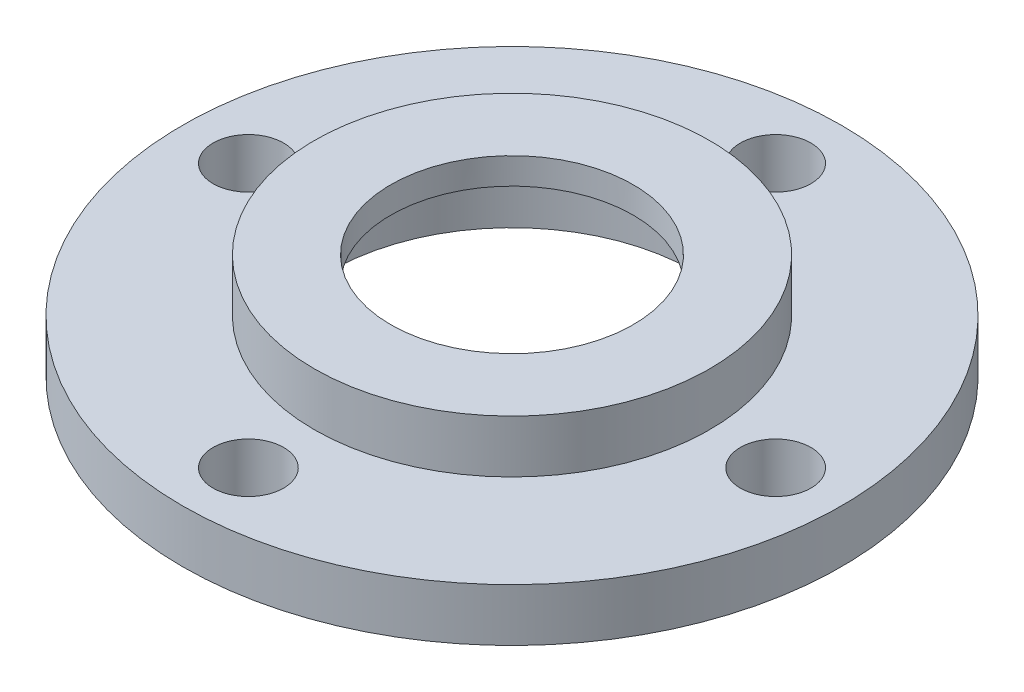
ISO-10303-21;
HEADER;
FILE_DESCRIPTION(('STEP AP214'),'2;1');
FILE_NAME('part.step','',(''),(''),'','','');
FILE_SCHEMA(('AUTOMOTIVE_DESIGN { 1 0 10303 214 1 1 1 1 }'));
ENDSEC;
DATA;
#1=APPLICATION_CONTEXT('core data for automotive mechanical design processes');
#2=APPLICATION_PROTOCOL_DEFINITION('international standard','automotive_design',2000,#1);
#3=PRODUCT_CONTEXT('',#1,'mechanical');
#4=PRODUCT('Part','Part','',(#3));
#5=PRODUCT_RELATED_PRODUCT_CATEGORY('part','',(#4));
#6=PRODUCT_DEFINITION_FORMATION('','',#4);
#7=PRODUCT_DEFINITION_CONTEXT('part definition',#1,'design');
#8=PRODUCT_DEFINITION('design','',#6,#7);
#9=PRODUCT_DEFINITION_SHAPE('','',#8);
#10=(LENGTH_UNIT() NAMED_UNIT(*) SI_UNIT(.MILLI.,.METRE.));
#11=(NAMED_UNIT(*) PLANE_ANGLE_UNIT() SI_UNIT($,.RADIAN.));
#12=(NAMED_UNIT(*) SI_UNIT($,.STERADIAN.) SOLID_ANGLE_UNIT());
#13=UNCERTAINTY_MEASURE_WITH_UNIT(LENGTH_MEASURE(1.E-05),#10,'distance_accuracy_value','');
#14=(GEOMETRIC_REPRESENTATION_CONTEXT(3) GLOBAL_UNCERTAINTY_ASSIGNED_CONTEXT((#13)) GLOBAL_UNIT_ASSIGNED_CONTEXT((#10,
#11,#12)) REPRESENTATION_CONTEXT('',''));
#15=CARTESIAN_POINT('',(0.,0.,0.));
#16=DIRECTION('',(0.,0.,1.));
#17=DIRECTION('',(1.,0.,0.));
#18=AXIS2_PLACEMENT_3D('',#15,#16,#17);
#19=CARTESIAN_POINT('',(0.,2.54,0.));
#20=DIRECTION('',(0.,-1.,0.));
#21=DIRECTION('',(0.,0.,-1.));
#22=AXIS2_PLACEMENT_3D('',#19,#20,#21);
#23=CYLINDRICAL_SURFACE('',#22,15.875);
#24=CARTESIAN_POINT('',(0.,2.54,0.));
#25=DIRECTION('',(0.,1.,0.));
#26=DIRECTION('',(0.,0.,1.));
#27=AXIS2_PLACEMENT_3D('',#24,#25,#26);
#28=CIRCLE('',#27,15.875);
#29=CARTESIAN_POINT('',(0.,2.54,15.875));
#30=VERTEX_POINT('',#29);
#31=EDGE_CURVE('E49',#30,#30,#28,.T.);
#32=ORIENTED_EDGE('',*,*,#31,.F.);
#33=EDGE_LOOP('',(#32));
#34=FACE_BOUND('',#33,.T.);
#35=CARTESIAN_POINT('',(0.,0.,0.));
#36=DIRECTION('',(0.,1.,0.));
#37=DIRECTION('',(0.,0.,1.));
#38=AXIS2_PLACEMENT_3D('',#35,#36,#37);
#39=CIRCLE('',#38,15.875);
#40=CARTESIAN_POINT('',(0.,0.,15.875));
#41=VERTEX_POINT('',#40);
#42=EDGE_CURVE('E44',#41,#41,#39,.T.);
#43=ORIENTED_EDGE('',*,*,#42,.T.);
#44=EDGE_LOOP('',(#43));
#45=FACE_BOUND('',#44,.T.);
#46=ADVANCED_FACE('F41',(#34,#45),#23,.T.);
#47=CARTESIAN_POINT('',(0.,2.54,0.));
#48=DIRECTION('',(0.,1.,0.));
#49=DIRECTION('',(0.,0.,1.));
#50=AXIS2_PLACEMENT_3D('',#47,#48,#49);
#51=PLANE('',#50);
#52=CARTESIAN_POINT('',(0.,2.54,-12.7));
#53=DIRECTION('',(0.,1.,0.));
#54=DIRECTION('',(0.,0.,1.));
#55=AXIS2_PLACEMENT_3D('',#52,#53,#54);
#56=CIRCLE('',#55,1.7);
#57=CARTESIAN_POINT('',(0.,2.54,-11.));
#58=VERTEX_POINT('',#57);
#59=EDGE_CURVE('E98',#58,#58,#56,.T.);
#60=ORIENTED_EDGE('',*,*,#59,.F.);
#61=EDGE_LOOP('',(#60));
#62=FACE_BOUND('',#61,.T.);
#63=CARTESIAN_POINT('',(12.7,2.54,0.));
#64=DIRECTION('',(0.,1.,0.));
#65=DIRECTION('',(0.,0.,1.));
#66=AXIS2_PLACEMENT_3D('',#63,#64,#65);
#67=CIRCLE('',#66,1.70000000000004);
#68=CARTESIAN_POINT('',(12.7,2.54,1.70000000000004));
#69=VERTEX_POINT('',#68);
#70=EDGE_CURVE('E94',#69,#69,#67,.T.);
#71=ORIENTED_EDGE('',*,*,#70,.F.);
#72=EDGE_LOOP('',(#71));
#73=FACE_BOUND('',#72,.T.);
#74=CARTESIAN_POINT('',(0.,2.54,12.7));
#75=DIRECTION('',(0.,1.,0.));
#76=DIRECTION('',(0.,0.,1.));
#77=AXIS2_PLACEMENT_3D('',#74,#75,#76);
#78=CIRCLE('',#77,1.7);
#79=CARTESIAN_POINT('',(0.,2.54,14.4));
#80=VERTEX_POINT('',#79);
#81=EDGE_CURVE('E86',#80,#80,#78,.T.);
#82=ORIENTED_EDGE('',*,*,#81,.F.);
#83=EDGE_LOOP('',(#82));
#84=FACE_BOUND('',#83,.T.);
#85=CARTESIAN_POINT('',(-12.7,2.54,0.));
#86=DIRECTION('',(0.,1.,0.));
#87=DIRECTION('',(0.,0.,1.));
#88=AXIS2_PLACEMENT_3D('',#85,#86,#87);
#89=CIRCLE('',#88,1.7);
#90=CARTESIAN_POINT('',(-12.7,2.54,1.7));
#91=VERTEX_POINT('',#90);
#92=EDGE_CURVE('E77',#91,#91,#89,.T.);
#93=ORIENTED_EDGE('',*,*,#92,.F.);
#94=EDGE_LOOP('',(#93));
#95=FACE_BOUND('',#94,.T.);
#96=CARTESIAN_POINT('',(0.,2.54,0.));
#97=DIRECTION('',(0.,1.,0.));
#98=DIRECTION('',(0.,0.,1.));
#99=AXIS2_PLACEMENT_3D('',#96,#97,#98);
#100=CIRCLE('',#99,9.525);
#101=CARTESIAN_POINT('',(0.,2.54,9.525));
#102=VERTEX_POINT('',#101);
#103=EDGE_CURVE('E10',#102,#102,#100,.T.);
#104=ORIENTED_EDGE('',*,*,#103,.F.);
#105=EDGE_LOOP('',(#104));
#106=FACE_BOUND('',#105,.T.);
#107=ORIENTED_EDGE('',*,*,#31,.T.);
#108=EDGE_LOOP('',(#107));
#109=FACE_BOUND('',#108,.T.);
#110=ADVANCED_FACE('F112',(#62,#73,#84,#95,#106,#109),#51,.T.);
#111=CARTESIAN_POINT('',(0.,0.,0.));
#112=DIRECTION('',(0.,1.,0.));
#113=DIRECTION('',(0.,0.,1.));
#114=AXIS2_PLACEMENT_3D('',#111,#112,#113);
#115=PLANE('',#114);
#116=CARTESIAN_POINT('',(0.,0.,-12.7));
#117=DIRECTION('',(0.,1.,0.));
#118=DIRECTION('',(0.,0.,1.));
#119=AXIS2_PLACEMENT_3D('',#116,#117,#118);
#120=CIRCLE('',#119,1.7);
#121=CARTESIAN_POINT('',(0.,0.,-11.));
#122=VERTEX_POINT('',#121);
#123=EDGE_CURVE('E73',#122,#122,#120,.F.);
#124=ORIENTED_EDGE('',*,*,#123,.F.);
#125=EDGE_LOOP('',(#124));
#126=FACE_BOUND('',#125,.T.);
#127=CARTESIAN_POINT('',(12.7,0.,0.));
#128=DIRECTION('',(0.,1.,0.));
#129=DIRECTION('',(0.,0.,1.));
#130=AXIS2_PLACEMENT_3D('',#127,#128,#129);
#131=CIRCLE('',#130,1.70000000000004);
#132=CARTESIAN_POINT('',(12.7,0.,1.70000000000004));
#133=VERTEX_POINT('',#132);
#134=EDGE_CURVE('E90',#133,#133,#131,.F.);
#135=ORIENTED_EDGE('',*,*,#134,.F.);
#136=EDGE_LOOP('',(#135));
#137=FACE_BOUND('',#136,.T.);
#138=CARTESIAN_POINT('',(0.,0.,12.7));
#139=DIRECTION('',(0.,1.,0.));
#140=DIRECTION('',(0.,0.,1.));
#141=AXIS2_PLACEMENT_3D('',#138,#139,#140);
#142=CIRCLE('',#141,1.7);
#143=CARTESIAN_POINT('',(0.,0.,14.4));
#144=VERTEX_POINT('',#143);
#145=EDGE_CURVE('E81',#144,#144,#142,.F.);
#146=ORIENTED_EDGE('',*,*,#145,.F.);
#147=EDGE_LOOP('',(#146));
#148=FACE_BOUND('',#147,.T.);
#149=CARTESIAN_POINT('',(-12.7,0.,0.));
#150=DIRECTION('',(0.,1.,0.));
#151=DIRECTION('',(0.,0.,1.));
#152=AXIS2_PLACEMENT_3D('',#149,#150,#151);
#153=CIRCLE('',#152,1.7);
#154=CARTESIAN_POINT('',(-12.7,0.,1.7));
#155=VERTEX_POINT('',#154);
#156=EDGE_CURVE('E82',#155,#155,#153,.F.);
#157=ORIENTED_EDGE('',*,*,#156,.F.);
#158=EDGE_LOOP('',(#157));
#159=FACE_BOUND('',#158,.T.);
#160=CARTESIAN_POINT('',(0.,0.,0.));
#161=DIRECTION('',(0.,-1.,0.));
#162=DIRECTION('',(0.,0.,-1.));
#163=AXIS2_PLACEMENT_3D('',#160,#161,#162);
#164=CIRCLE('',#163,8.7757);
#165=CARTESIAN_POINT('',(0.,0.,-8.7757));
#166=VERTEX_POINT('',#165);
#167=EDGE_CURVE('E61',#166,#166,#164,.T.);
#168=ORIENTED_EDGE('',*,*,#167,.F.);
#169=EDGE_LOOP('',(#168));
#170=FACE_BOUND('',#169,.T.);
#171=ORIENTED_EDGE('',*,*,#42,.F.);
#172=EDGE_LOOP('',(#171));
#173=FACE_BOUND('',#172,.T.);
#174=ADVANCED_FACE('F115',(#126,#137,#148,#159,#170,#173),#115,.F.);
#175=CARTESIAN_POINT('',(0.,5.08,0.));
#176=DIRECTION('',(0.,-1.,0.));
#177=DIRECTION('',(0.,0.,-1.));
#178=AXIS2_PLACEMENT_3D('',#175,#176,#177);
#179=CYLINDRICAL_SURFACE('',#178,9.525);
#180=CARTESIAN_POINT('',(0.,5.08,0.));
#181=DIRECTION('',(0.,1.,0.));
#182=DIRECTION('',(0.,0.,1.));
#183=AXIS2_PLACEMENT_3D('',#180,#181,#182);
#184=CIRCLE('',#183,9.525);
#185=CARTESIAN_POINT('',(0.,5.08,9.525));
#186=VERTEX_POINT('',#185);
#187=EDGE_CURVE('E56',#186,#186,#184,.T.);
#188=ORIENTED_EDGE('',*,*,#187,.F.);
#189=EDGE_LOOP('',(#188));
#190=FACE_BOUND('',#189,.T.);
#191=ORIENTED_EDGE('',*,*,#103,.T.);
#192=EDGE_LOOP('',(#191));
#193=FACE_BOUND('',#192,.T.);
#194=ADVANCED_FACE('F133',(#190,#193),#179,.T.);
#195=CARTESIAN_POINT('',(0.,5.08,0.));
#196=DIRECTION('',(0.,1.,0.));
#197=DIRECTION('',(0.,0.,1.));
#198=AXIS2_PLACEMENT_3D('',#195,#196,#197);
#199=PLANE('',#198);
#200=CARTESIAN_POINT('',(0.,5.08,0.));
#201=DIRECTION('',(0.,1.,0.));
#202=DIRECTION('',(0.,0.,1.));
#203=AXIS2_PLACEMENT_3D('',#200,#201,#202);
#204=CIRCLE('',#203,5.842);
#205=CARTESIAN_POINT('',(0.,5.08,5.842));
#206=VERTEX_POINT('',#205);
#207=EDGE_CURVE('E65',#206,#206,#204,.T.);
#208=ORIENTED_EDGE('',*,*,#207,.F.);
#209=EDGE_LOOP('',(#208));
#210=FACE_BOUND('',#209,.T.);
#211=ORIENTED_EDGE('',*,*,#187,.T.);
#212=EDGE_LOOP('',(#211));
#213=FACE_BOUND('',#212,.T.);
#214=ADVANCED_FACE('F138',(#210,#213),#199,.T.);
#215=CARTESIAN_POINT('',(0.,3.81,0.));
#216=DIRECTION('',(0.,-1.,0.));
#217=DIRECTION('',(0.,0.,-1.));
#218=AXIS2_PLACEMENT_3D('',#215,#216,#217);
#219=CYLINDRICAL_SURFACE('',#218,8.7757);
#220=CARTESIAN_POINT('',(0.,3.81,0.));
#221=DIRECTION('',(0.,-1.,0.));
#222=DIRECTION('',(0.,0.,-1.));
#223=AXIS2_PLACEMENT_3D('',#220,#221,#222);
#224=CIRCLE('',#223,8.7757);
#225=CARTESIAN_POINT('',(0.,3.81,-8.7757));
#226=VERTEX_POINT('',#225);
#227=EDGE_CURVE('E60',#226,#226,#224,.T.);
#228=CARTESIAN_POINT('',(0.,3.81,-8.7757));
#229=CARTESIAN_POINT('',(0.,3.7703125,-8.7757));
#230=CARTESIAN_POINT('',(0.,3.730625,-8.7757));
#231=CARTESIAN_POINT('',(0.,3.65125,-8.7757));
#232=CARTESIAN_POINT('',(0.,3.6115625,-8.7757));
#233=CARTESIAN_POINT('',(0.,3.5321875,-8.7757));
#234=CARTESIAN_POINT('',(0.,3.4925,-8.7757));
#235=CARTESIAN_POINT('',(0.,3.413125,-8.7757));
#236=CARTESIAN_POINT('',(0.,3.3734375,-8.7757));
#237=CARTESIAN_POINT('',(0.,3.2940625,-8.7757));
#238=CARTESIAN_POINT('',(0.,3.254375,-8.7757));
#239=CARTESIAN_POINT('',(0.,3.175,-8.7757));
#240=CARTESIAN_POINT('',(0.,3.1353125,-8.7757));
#241=CARTESIAN_POINT('',(0.,3.0559375,-8.7757));
#242=CARTESIAN_POINT('',(0.,3.01625,-8.7757));
#243=CARTESIAN_POINT('',(0.,2.936875,-8.7757));
#244=CARTESIAN_POINT('',(0.,2.8971875,-8.7757));
#245=CARTESIAN_POINT('',(0.,2.8178125,-8.7757));
#246=CARTESIAN_POINT('',(0.,2.778125,-8.7757));
#247=CARTESIAN_POINT('',(0.,2.69875,-8.7757));
#248=CARTESIAN_POINT('',(0.,2.6590625,-8.7757));
#249=CARTESIAN_POINT('',(0.,2.5796875,-8.7757));
#250=CARTESIAN_POINT('',(0.,2.54,-8.7757));
#251=CARTESIAN_POINT('',(0.,2.460625,-8.7757));
#252=CARTESIAN_POINT('',(0.,2.4209375,-8.7757));
#253=CARTESIAN_POINT('',(0.,2.3415625,-8.7757));
#254=CARTESIAN_POINT('',(0.,2.301875,-8.7757));
#255=CARTESIAN_POINT('',(0.,2.2225,-8.7757));
#256=CARTESIAN_POINT('',(0.,2.1828125,-8.7757));
#257=CARTESIAN_POINT('',(0.,2.1034375,-8.7757));
#258=CARTESIAN_POINT('',(0.,2.06375,-8.7757));
#259=CARTESIAN_POINT('',(0.,1.984375,-8.7757));
#260=CARTESIAN_POINT('',(0.,1.9446875,-8.7757));
#261=CARTESIAN_POINT('',(0.,1.8653125,-8.7757));
#262=CARTESIAN_POINT('',(0.,1.825625,-8.7757));
#263=CARTESIAN_POINT('',(0.,1.74625,-8.7757));
#264=CARTESIAN_POINT('',(0.,1.7065625,-8.7757));
#265=CARTESIAN_POINT('',(0.,1.6271875,-8.7757));
#266=CARTESIAN_POINT('',(0.,1.5875,-8.7757));
#267=CARTESIAN_POINT('',(0.,1.508125,-8.7757));
#268=CARTESIAN_POINT('',(0.,1.4684375,-8.7757));
#269=CARTESIAN_POINT('',(0.,1.3890625,-8.7757));
#270=CARTESIAN_POINT('',(0.,1.349375,-8.7757));
#271=CARTESIAN_POINT('',(0.,1.27,-8.7757));
#272=CARTESIAN_POINT('',(0.,1.2303125,-8.7757));
#273=CARTESIAN_POINT('',(0.,1.1509375,-8.7757));
#274=CARTESIAN_POINT('',(0.,1.11125,-8.7757));
#275=CARTESIAN_POINT('',(0.,1.031875,-8.7757));
#276=CARTESIAN_POINT('',(0.,0.9921875,-8.7757));
#277=CARTESIAN_POINT('',(0.,0.9128125,-8.7757));
#278=CARTESIAN_POINT('',(0.,0.873125,-8.7757));
#279=CARTESIAN_POINT('',(0.,0.79375,-8.7757));
#280=CARTESIAN_POINT('',(0.,0.7540625,-8.7757));
#281=CARTESIAN_POINT('',(0.,0.6746875,-8.7757));
#282=CARTESIAN_POINT('',(0.,0.635,-8.7757));
#283=CARTESIAN_POINT('',(0.,0.555625,-8.7757));
#284=CARTESIAN_POINT('',(0.,0.5159375,-8.7757));
#285=CARTESIAN_POINT('',(0.,0.4365625,-8.7757));
#286=CARTESIAN_POINT('',(0.,0.396875,-8.7757));
#287=CARTESIAN_POINT('',(0.,0.3175,-8.7757));
#288=CARTESIAN_POINT('',(0.,0.2778125,-8.7757));
#289=CARTESIAN_POINT('',(0.,0.1984375,-8.7757));
#290=CARTESIAN_POINT('',(0.,0.15875,-8.7757));
#291=CARTESIAN_POINT('',(0.,0.0793749999999999,-8.7757));
#292=CARTESIAN_POINT('',(0.,0.0396874999999999,-8.7757));
#293=CARTESIAN_POINT('',(0.,0.,-8.7757));
#294=B_SPLINE_CURVE_WITH_KNOTS('',3,(#228,#229,#230,#231,#232,#233,#234,#235,#236,#237,#238,
#239,#240,#241,#242,#243,#244,#245,#246,#247,#248,#249,#250,#251,#252,#253,#254,#255,#256,#257,
#258,#259,#260,#261,#262,#263,#264,#265,#266,#267,#268,#269,#270,#271,#272,#273,#274,#275,#276,
#277,#278,#279,#280,#281,#282,#283,#284,#285,#286,#287,#288,#289,#290,#291,#292,#293),
.UNSPECIFIED.,.F.,.F.,(4,2,2,2,2,2,2,2,2,2,2,2,2,2,2,2,2,2,2,2,2,2,2,2,2,2,2,2,2,2,2,2,4),(0.,
0.1190625,0.238125,0.3571875,0.47625,0.5953125,0.714375,0.833437499999999,0.9525,1.0715625,
1.190625,1.3096875,1.42875,1.5478125,1.666875,1.7859375,1.905,2.0240625,2.143125,2.2621875,
2.38125,2.5003125,2.619375,2.7384375,2.8575,2.9765625,3.095625,3.2146875,3.33375,3.4528125,
3.571875,3.6909375,3.81),.UNSPECIFIED.);
#295=EDGE_CURVE('BSEAM146',#226,#166,#294,.T.);
#296=ORIENTED_EDGE('',*,*,#227,.F.);
#297=ORIENTED_EDGE('',*,*,#167,.T.);
#298=ORIENTED_EDGE('',*,*,#295,.T.);
#299=ORIENTED_EDGE('',*,*,#295,.F.);
#300=EDGE_LOOP('',(#296,#298,#297,#299));
#301=FACE_BOUND('',#300,.T.);
#302=ADVANCED_FACE('F146',(#301),#219,.F.);
#303=CARTESIAN_POINT('',(0.,3.81,0.));
#304=DIRECTION('',(0.,-1.,0.));
#305=DIRECTION('',(0.,0.,-1.));
#306=AXIS2_PLACEMENT_3D('',#303,#304,#305);
#307=PLANE('',#306);
#308=CARTESIAN_POINT('',(0.,3.81,0.));
#309=DIRECTION('',(0.,-1.,0.));
#310=DIRECTION('',(0.,0.,-1.));
#311=AXIS2_PLACEMENT_3D('',#308,#309,#310);
#312=CIRCLE('',#311,5.842);
#313=CARTESIAN_POINT('',(0.,3.81,-5.842));
#314=VERTEX_POINT('',#313);
#315=EDGE_CURVE('E69',#314,#314,#312,.F.);
#316=ORIENTED_EDGE('',*,*,#315,.T.);
#317=EDGE_LOOP('',(#316));
#318=FACE_BOUND('',#317,.T.);
#319=ORIENTED_EDGE('',*,*,#227,.T.);
#320=EDGE_LOOP('',(#319));
#321=FACE_BOUND('',#320,.T.);
#322=ADVANCED_FACE('F150',(#318,#321),#307,.T.);
#323=CARTESIAN_POINT('',(0.,-0.00100000000000013,0.));
#324=DIRECTION('',(0.,1.,0.));
#325=DIRECTION('',(0.,0.,1.));
#326=AXIS2_PLACEMENT_3D('',#323,#324,#325);
#327=CYLINDRICAL_SURFACE('',#326,5.842);
#328=ORIENTED_EDGE('',*,*,#315,.F.);
#329=EDGE_LOOP('',(#328));
#330=FACE_BOUND('',#329,.T.);
#331=ORIENTED_EDGE('',*,*,#207,.T.);
#332=EDGE_LOOP('',(#331));
#333=FACE_BOUND('',#332,.T.);
#334=ADVANCED_FACE('F154',(#330,#333),#327,.F.);
#335=CARTESIAN_POINT('',(-12.7,-0.00100000000000013,0.));
#336=DIRECTION('',(0.,1.,0.));
#337=DIRECTION('',(0.,0.,1.));
#338=AXIS2_PLACEMENT_3D('',#335,#336,#337);
#339=CYLINDRICAL_SURFACE('',#338,1.7);
#340=ORIENTED_EDGE('',*,*,#92,.T.);
#341=EDGE_LOOP('',(#340));
#342=FACE_BOUND('',#341,.T.);
#343=ORIENTED_EDGE('',*,*,#156,.T.);
#344=EDGE_LOOP('',(#343));
#345=FACE_BOUND('',#344,.T.);
#346=ADVANCED_FACE('F158',(#342,#345),#339,.F.);
#347=CARTESIAN_POINT('',(0.,-0.00100000000000013,12.7));
#348=DIRECTION('',(0.,1.,0.));
#349=DIRECTION('',(0.,0.,1.));
#350=AXIS2_PLACEMENT_3D('',#347,#348,#349);
#351=CYLINDRICAL_SURFACE('',#350,1.7);
#352=ORIENTED_EDGE('',*,*,#81,.T.);
#353=EDGE_LOOP('',(#352));
#354=FACE_BOUND('',#353,.T.);
#355=ORIENTED_EDGE('',*,*,#145,.T.);
#356=EDGE_LOOP('',(#355));
#357=FACE_BOUND('',#356,.T.);
#358=ADVANCED_FACE('F162',(#354,#357),#351,.F.);
#359=CARTESIAN_POINT('',(12.7,-0.00100000000000013,0.));
#360=DIRECTION('',(0.,1.,0.));
#361=DIRECTION('',(0.,0.,1.));
#362=AXIS2_PLACEMENT_3D('',#359,#360,#361);
#363=CYLINDRICAL_SURFACE('',#362,1.70000000000004);
#364=ORIENTED_EDGE('',*,*,#70,.T.);
#365=EDGE_LOOP('',(#364));
#366=FACE_BOUND('',#365,.T.);
#367=ORIENTED_EDGE('',*,*,#134,.T.);
#368=EDGE_LOOP('',(#367));
#369=FACE_BOUND('',#368,.T.);
#370=ADVANCED_FACE('F166',(#366,#369),#363,.F.);
#371=CARTESIAN_POINT('',(0.,-0.00100000000000013,-12.7));
#372=DIRECTION('',(0.,1.,0.));
#373=DIRECTION('',(0.,0.,1.));
#374=AXIS2_PLACEMENT_3D('',#371,#372,#373);
#375=CYLINDRICAL_SURFACE('',#374,1.7);
#376=ORIENTED_EDGE('',*,*,#59,.T.);
#377=EDGE_LOOP('',(#376));
#378=FACE_BOUND('',#377,.T.);
#379=ORIENTED_EDGE('',*,*,#123,.T.);
#380=EDGE_LOOP('',(#379));
#381=FACE_BOUND('',#380,.T.);
#382=ADVANCED_FACE('F109',(#378,#381),#375,.F.);
#383=CLOSED_SHELL('',(#46,#110,#174,#194,#214,#302,#322,#334,#346,#358,#370,#382));
#384=MANIFOLD_SOLID_BREP('B2',#383);
#385=ADVANCED_BREP_SHAPE_REPRESENTATION('',(#18,#384),#14);
#386=SHAPE_DEFINITION_REPRESENTATION(#9,#385);
ENDSEC;
END-ISO-10303-21;
